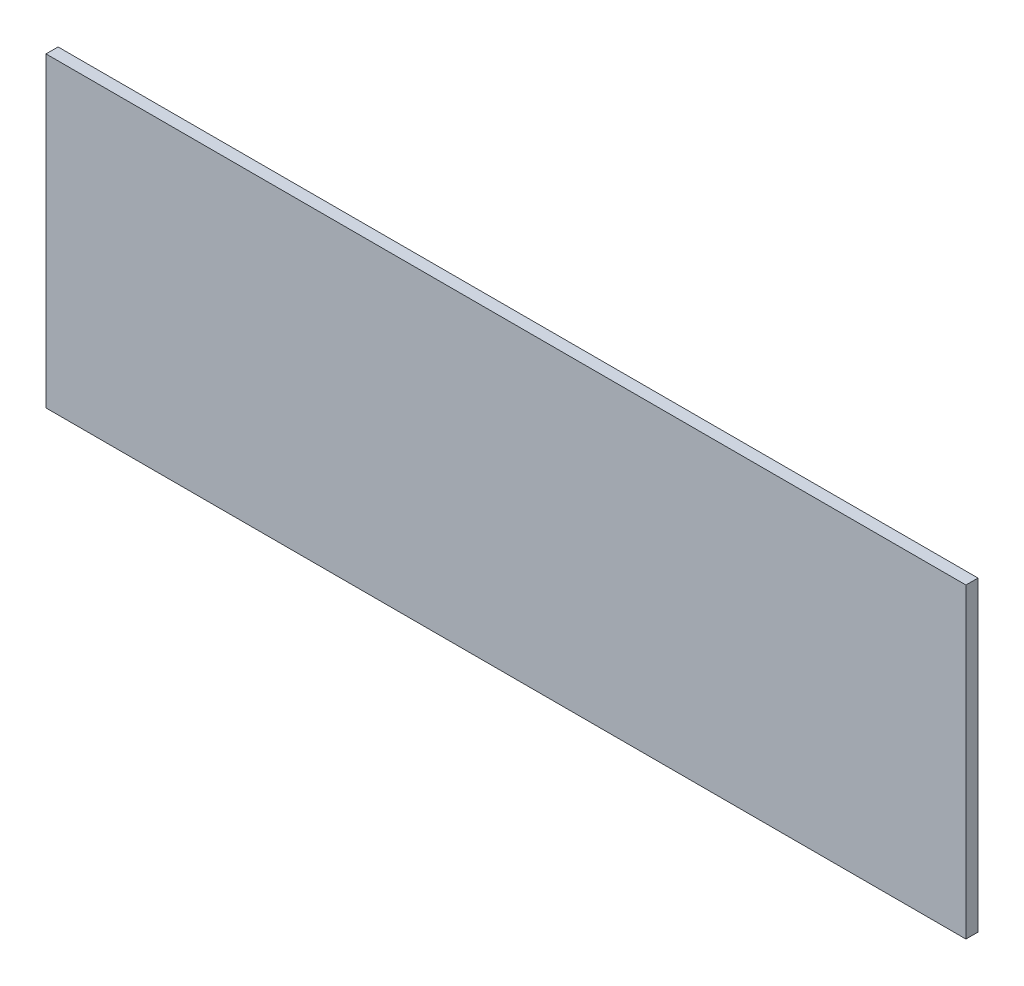
ISO-10303-21;
HEADER;
FILE_DESCRIPTION(('STEP AP214'),'2;1');
FILE_NAME('part.step','',(''),(''),'','','');
FILE_SCHEMA(('AUTOMOTIVE_DESIGN { 1 0 10303 214 1 1 1 1 }'));
ENDSEC;
DATA;
#1=APPLICATION_CONTEXT('core data for automotive mechanical design processes');
#2=APPLICATION_PROTOCOL_DEFINITION('international standard','automotive_design',2000,#1);
#3=PRODUCT_CONTEXT('',#1,'mechanical');
#4=PRODUCT('Part','Part','',(#3));
#5=PRODUCT_RELATED_PRODUCT_CATEGORY('part','',(#4));
#6=PRODUCT_DEFINITION_FORMATION('','',#4);
#7=PRODUCT_DEFINITION_CONTEXT('part definition',#1,'design');
#8=PRODUCT_DEFINITION('design','',#6,#7);
#9=PRODUCT_DEFINITION_SHAPE('','',#8);
#10=(LENGTH_UNIT() NAMED_UNIT(*) SI_UNIT(.MILLI.,.METRE.));
#11=(NAMED_UNIT(*) PLANE_ANGLE_UNIT() SI_UNIT($,.RADIAN.));
#12=(NAMED_UNIT(*) SI_UNIT($,.STERADIAN.) SOLID_ANGLE_UNIT());
#13=UNCERTAINTY_MEASURE_WITH_UNIT(LENGTH_MEASURE(1.E-05),#10,'distance_accuracy_value','');
#14=(GEOMETRIC_REPRESENTATION_CONTEXT(3) GLOBAL_UNCERTAINTY_ASSIGNED_CONTEXT((#13)) GLOBAL_UNIT_ASSIGNED_CONTEXT((#10,
#11,#12)) REPRESENTATION_CONTEXT('',''));
#15=CARTESIAN_POINT('',(0.,0.,0.));
#16=DIRECTION('',(0.,0.,1.));
#17=DIRECTION('',(1.,0.,0.));
#18=AXIS2_PLACEMENT_3D('',#15,#16,#17);
#19=CARTESIAN_POINT('',(2.54,0.,0.));
#20=DIRECTION('',(0.,0.,1.));
#21=DIRECTION('',(1.,0.,0.));
#22=AXIS2_PLACEMENT_3D('',#19,#20,#21);
#23=PLANE('',#22);
#24=DIRECTION('',(1.,0.,0.));
#25=VECTOR('',#24,1.);
#26=CARTESIAN_POINT('',(6.35,1.27,0.));
#27=LINE('',#26,#25);
#28=CARTESIAN_POINT('',(6.35,1.27,0.));
#29=VERTEX_POINT('',#28);
#30=CARTESIAN_POINT('',(-1.27,1.27,0.));
#31=VERTEX_POINT('',#30);
#32=EDGE_CURVE('E79',#29,#31,#27,.F.);
#33=ORIENTED_EDGE('',*,*,#32,.F.);
#34=DIRECTION('',(0.,1.,0.));
#35=VECTOR('',#34,1.);
#36=CARTESIAN_POINT('',(6.35,-1.27,0.));
#37=LINE('',#36,#35);
#38=CARTESIAN_POINT('',(6.35,-1.27,0.));
#39=VERTEX_POINT('',#38);
#40=EDGE_CURVE('E55',#39,#29,#37,.T.);
#41=ORIENTED_EDGE('',*,*,#40,.F.);
#42=DIRECTION('',(1.,0.,0.));
#43=VECTOR('',#42,1.);
#44=CARTESIAN_POINT('',(-1.27,-1.27,0.));
#45=LINE('',#44,#43);
#46=CARTESIAN_POINT('',(-1.27,-1.27,0.));
#47=VERTEX_POINT('',#46);
#48=EDGE_CURVE('E57',#47,#39,#45,.T.);
#49=ORIENTED_EDGE('',*,*,#48,.F.);
#50=DIRECTION('',(0.,1.,0.));
#51=VECTOR('',#50,1.);
#52=CARTESIAN_POINT('',(-1.27,1.27,0.));
#53=LINE('',#52,#51);
#54=EDGE_CURVE('E20',#31,#47,#53,.F.);
#55=ORIENTED_EDGE('',*,*,#54,.F.);
#56=EDGE_LOOP('',(#33,#41,#49,#55));
#57=FACE_BOUND('',#56,.T.);
#58=ADVANCED_FACE('F17',(#57),#23,.F.);
#59=CARTESIAN_POINT('',(-1.27,1.27,0.));
#60=DIRECTION('',(-1.,0.,0.));
#61=DIRECTION('',(0.,0.,1.));
#62=AXIS2_PLACEMENT_3D('',#59,#60,#61);
#63=PLANE('',#62);
#64=DIRECTION('',(0.,1.,0.));
#65=VECTOR('',#64,1.);
#66=CARTESIAN_POINT('',(-1.27,0.,0.1));
#67=LINE('',#66,#65);
#68=CARTESIAN_POINT('',(-1.27,1.27,0.1));
#69=VERTEX_POINT('',#68);
#70=CARTESIAN_POINT('',(-1.27,-1.27,0.1));
#71=VERTEX_POINT('',#70);
#72=EDGE_CURVE('E83',#69,#71,#67,.F.);
#73=ORIENTED_EDGE('',*,*,#72,.F.);
#74=DIRECTION('',(0.,0.,1.));
#75=VECTOR('',#74,1.);
#76=CARTESIAN_POINT('',(-1.27,1.27,0.));
#77=LINE('',#76,#75);
#78=EDGE_CURVE('E68',#31,#69,#77,.T.);
#79=ORIENTED_EDGE('',*,*,#78,.F.);
#80=ORIENTED_EDGE('',*,*,#54,.T.);
#81=DIRECTION('',(0.,0.,-1.));
#82=VECTOR('',#81,1.);
#83=CARTESIAN_POINT('',(-1.27,-1.27,0.));
#84=LINE('',#83,#82);
#85=EDGE_CURVE('E63',#71,#47,#84,.T.);
#86=ORIENTED_EDGE('',*,*,#85,.F.);
#87=EDGE_LOOP('',(#73,#79,#80,#86));
#88=FACE_BOUND('',#87,.T.);
#89=ADVANCED_FACE('F65',(#88),#63,.T.);
#90=CARTESIAN_POINT('',(-1.27,-1.27,0.));
#91=DIRECTION('',(0.,-1.,0.));
#92=DIRECTION('',(0.,0.,-1.));
#93=AXIS2_PLACEMENT_3D('',#90,#91,#92);
#94=PLANE('',#93);
#95=DIRECTION('',(1.,0.,0.));
#96=VECTOR('',#95,1.);
#97=CARTESIAN_POINT('',(2.54,-1.27,0.1));
#98=LINE('',#97,#96);
#99=CARTESIAN_POINT('',(6.35,-1.27,0.1));
#100=VERTEX_POINT('',#99);
#101=EDGE_CURVE('E72',#71,#100,#98,.T.);
#102=ORIENTED_EDGE('',*,*,#101,.F.);
#103=ORIENTED_EDGE('',*,*,#85,.T.);
#104=ORIENTED_EDGE('',*,*,#48,.T.);
#105=DIRECTION('',(0.,0.,-1.));
#106=VECTOR('',#105,1.);
#107=CARTESIAN_POINT('',(6.35,-1.27,0.));
#108=LINE('',#107,#106);
#109=EDGE_CURVE('E75',#100,#39,#108,.T.);
#110=ORIENTED_EDGE('',*,*,#109,.F.);
#111=EDGE_LOOP('',(#102,#103,#104,#110));
#112=FACE_BOUND('',#111,.T.);
#113=ADVANCED_FACE('F70',(#112),#94,.T.);
#114=CARTESIAN_POINT('',(6.35,-1.27,0.));
#115=DIRECTION('',(1.,0.,0.));
#116=DIRECTION('',(0.,0.,-1.));
#117=AXIS2_PLACEMENT_3D('',#114,#115,#116);
#118=PLANE('',#117);
#119=DIRECTION('',(0.,1.,0.));
#120=VECTOR('',#119,1.);
#121=CARTESIAN_POINT('',(6.35,0.,0.1));
#122=LINE('',#121,#120);
#123=CARTESIAN_POINT('',(6.35,1.27,0.1));
#124=VERTEX_POINT('',#123);
#125=EDGE_CURVE('E26',#100,#124,#122,.T.);
#126=ORIENTED_EDGE('',*,*,#125,.F.);
#127=ORIENTED_EDGE('',*,*,#109,.T.);
#128=ORIENTED_EDGE('',*,*,#40,.T.);
#129=DIRECTION('',(0.,0.,1.));
#130=VECTOR('',#129,1.);
#131=CARTESIAN_POINT('',(6.35,1.27,0.));
#132=LINE('',#131,#130);
#133=EDGE_CURVE('E35',#124,#29,#132,.F.);
#134=ORIENTED_EDGE('',*,*,#133,.F.);
#135=EDGE_LOOP('',(#126,#127,#128,#134));
#136=FACE_BOUND('',#135,.T.);
#137=ADVANCED_FACE('F89',(#136),#118,.T.);
#138=CARTESIAN_POINT('',(6.35,1.27,0.));
#139=DIRECTION('',(0.,1.,0.));
#140=DIRECTION('',(0.,0.,1.));
#141=AXIS2_PLACEMENT_3D('',#138,#139,#140);
#142=PLANE('',#141);
#143=DIRECTION('',(1.,0.,0.));
#144=VECTOR('',#143,1.);
#145=CARTESIAN_POINT('',(2.54,1.27,0.1));
#146=LINE('',#145,#144);
#147=EDGE_CURVE('E11',#124,#69,#146,.F.);
#148=ORIENTED_EDGE('',*,*,#147,.F.);
#149=ORIENTED_EDGE('',*,*,#133,.T.);
#150=ORIENTED_EDGE('',*,*,#32,.T.);
#151=ORIENTED_EDGE('',*,*,#78,.T.);
#152=EDGE_LOOP('',(#148,#149,#150,#151));
#153=FACE_BOUND('',#152,.T.);
#154=ADVANCED_FACE('F91',(#153),#142,.T.);
#155=CARTESIAN_POINT('',(2.54,0.,0.1));
#156=DIRECTION('',(0.,0.,1.));
#157=DIRECTION('',(1.,0.,0.));
#158=AXIS2_PLACEMENT_3D('',#155,#156,#157);
#159=PLANE('',#158);
#160=ORIENTED_EDGE('',*,*,#125,.T.);
#161=ORIENTED_EDGE('',*,*,#147,.T.);
#162=ORIENTED_EDGE('',*,*,#72,.T.);
#163=ORIENTED_EDGE('',*,*,#101,.T.);
#164=EDGE_LOOP('',(#160,#161,#162,#163));
#165=FACE_BOUND('',#164,.T.);
#166=ADVANCED_FACE('F88',(#165),#159,.T.);
#167=CLOSED_SHELL('',(#58,#89,#113,#137,#154,#166));
#168=MANIFOLD_SOLID_BREP('B1',#167);
#169=ADVANCED_BREP_SHAPE_REPRESENTATION('',(#18,#168),#14);
#170=SHAPE_DEFINITION_REPRESENTATION(#9,#169);
ENDSEC;
END-ISO-10303-21;
